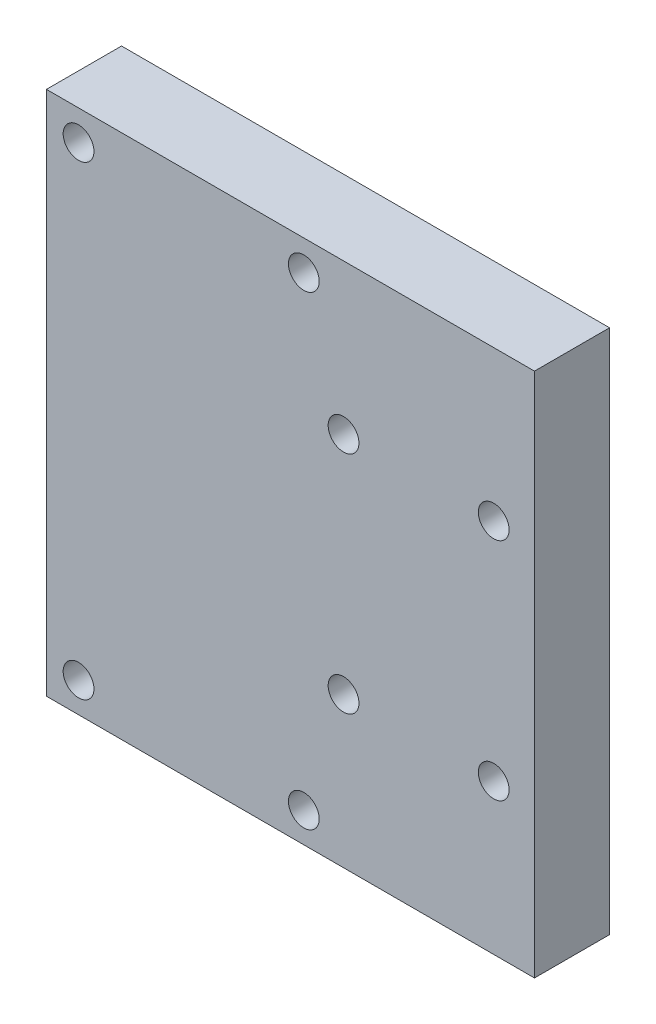
ISO-10303-21;
HEADER;
FILE_DESCRIPTION(('STEP AP214'),'2;1');
FILE_NAME('part.step','',(''),(''),'','','');
FILE_SCHEMA(('AUTOMOTIVE_DESIGN { 1 0 10303 214 1 1 1 1 }'));
ENDSEC;
DATA;
#1=APPLICATION_CONTEXT('core data for automotive mechanical design processes');
#2=APPLICATION_PROTOCOL_DEFINITION('international standard','automotive_design',2000,#1);
#3=PRODUCT_CONTEXT('',#1,'mechanical');
#4=PRODUCT('Part','Part','',(#3));
#5=PRODUCT_RELATED_PRODUCT_CATEGORY('part','',(#4));
#6=PRODUCT_DEFINITION_FORMATION('','',#4);
#7=PRODUCT_DEFINITION_CONTEXT('part definition',#1,'design');
#8=PRODUCT_DEFINITION('design','',#6,#7);
#9=PRODUCT_DEFINITION_SHAPE('','',#8);
#10=(LENGTH_UNIT() NAMED_UNIT(*) SI_UNIT(.MILLI.,.METRE.));
#11=(NAMED_UNIT(*) PLANE_ANGLE_UNIT() SI_UNIT($,.RADIAN.));
#12=(NAMED_UNIT(*) SI_UNIT($,.STERADIAN.) SOLID_ANGLE_UNIT());
#13=UNCERTAINTY_MEASURE_WITH_UNIT(LENGTH_MEASURE(1.E-05),#10,'distance_accuracy_value','');
#14=(GEOMETRIC_REPRESENTATION_CONTEXT(3) GLOBAL_UNCERTAINTY_ASSIGNED_CONTEXT((#13)) GLOBAL_UNIT_ASSIGNED_CONTEXT((#10,
#11,#12)) REPRESENTATION_CONTEXT('',''));
#15=CARTESIAN_POINT('',(0.,0.,0.));
#16=DIRECTION('',(0.,0.,1.));
#17=DIRECTION('',(1.,0.,0.));
#18=AXIS2_PLACEMENT_3D('',#15,#16,#17);
#19=CARTESIAN_POINT('',(0.,0.,10.));
#20=DIRECTION('',(0.,0.,1.));
#21=DIRECTION('',(1.,0.,0.));
#22=AXIS2_PLACEMENT_3D('',#19,#20,#21);
#23=PLANE('',#22);
#24=CARTESIAN_POINT('',(7.07003452523898,-15.,10.));
#25=DIRECTION('',(0.,0.,1.));
#26=DIRECTION('',(1.,0.,0.));
#27=AXIS2_PLACEMENT_3D('',#24,#25,#26);
#28=CIRCLE('',#27,2.05);
#29=CARTESIAN_POINT('',(9.12003452523898,-15.,10.));
#30=VERTEX_POINT('',#29);
#31=EDGE_CURVE('E148',#30,#30,#28,.T.);
#32=ORIENTED_EDGE('',*,*,#31,.F.);
#33=EDGE_LOOP('',(#32));
#34=FACE_BOUND('',#33,.T.);
#35=CARTESIAN_POINT('',(7.07003452523898,15.,10.));
#36=DIRECTION('',(0.,0.,1.));
#37=DIRECTION('',(1.,0.,0.));
#38=AXIS2_PLACEMENT_3D('',#35,#36,#37);
#39=CIRCLE('',#38,2.05);
#40=CARTESIAN_POINT('',(9.12003452523898,15.,10.));
#41=VERTEX_POINT('',#40);
#42=EDGE_CURVE('E136',#41,#41,#39,.T.);
#43=ORIENTED_EDGE('',*,*,#42,.F.);
#44=EDGE_LOOP('',(#43));
#45=FACE_BOUND('',#44,.T.);
#46=CARTESIAN_POINT('',(1.77843916611503,-31.,10.));
#47=DIRECTION('',(0.,0.,1.));
#48=DIRECTION('',(1.,0.,0.));
#49=AXIS2_PLACEMENT_3D('',#46,#47,#48);
#50=CIRCLE('',#49,2.05);
#51=CARTESIAN_POINT('',(3.82843916611503,-31.,10.));
#52=VERTEX_POINT('',#51);
#53=EDGE_CURVE('E124',#52,#52,#50,.T.);
#54=ORIENTED_EDGE('',*,*,#53,.F.);
#55=EDGE_LOOP('',(#54));
#56=FACE_BOUND('',#55,.T.);
#57=CARTESIAN_POINT('',(1.77843916611503,31.,10.));
#58=DIRECTION('',(0.,0.,1.));
#59=DIRECTION('',(1.,0.,0.));
#60=AXIS2_PLACEMENT_3D('',#57,#58,#59);
#61=CIRCLE('',#60,2.05);
#62=CARTESIAN_POINT('',(3.82843916611503,31.,10.));
#63=VERTEX_POINT('',#62);
#64=EDGE_CURVE('E103',#63,#63,#61,.T.);
#65=ORIENTED_EDGE('',*,*,#64,.F.);
#66=EDGE_LOOP('',(#65));
#67=FACE_BOUND('',#66,.T.);
#68=DIRECTION('',(0.,-1.,0.));
#69=VECTOR('',#68,1.);
#70=CARTESIAN_POINT('',(-32.5,35.,10.));
#71=LINE('',#70,#69);
#72=CARTESIAN_POINT('',(-32.5,35.,10.));
#73=VERTEX_POINT('',#72);
#74=CARTESIAN_POINT('',(-32.5,-35.,10.));
#75=VERTEX_POINT('',#74);
#76=EDGE_CURVE('E88',#73,#75,#71,.T.);
#77=ORIENTED_EDGE('',*,*,#76,.T.);
#78=DIRECTION('',(1.,0.,0.));
#79=VECTOR('',#78,1.);
#80=CARTESIAN_POINT('',(-32.5,-35.,10.));
#81=LINE('',#80,#79);
#82=CARTESIAN_POINT('',(32.5,-35.,10.));
#83=VERTEX_POINT('',#82);
#84=EDGE_CURVE('E83',#75,#83,#81,.T.);
#85=ORIENTED_EDGE('',*,*,#84,.T.);
#86=DIRECTION('',(0.,1.,0.));
#87=VECTOR('',#86,1.);
#88=CARTESIAN_POINT('',(32.5,35.,10.));
#89=LINE('',#88,#87);
#90=CARTESIAN_POINT('',(32.5,35.,10.));
#91=VERTEX_POINT('',#90);
#92=EDGE_CURVE('E86',#83,#91,#89,.T.);
#93=ORIENTED_EDGE('',*,*,#92,.T.);
#94=DIRECTION('',(-1.,0.,0.));
#95=VECTOR('',#94,1.);
#96=CARTESIAN_POINT('',(-32.5,35.,10.));
#97=LINE('',#96,#95);
#98=EDGE_CURVE('E53',#91,#73,#97,.T.);
#99=ORIENTED_EDGE('',*,*,#98,.T.);
#100=EDGE_LOOP('',(#77,#85,#93,#99));
#101=FACE_BOUND('',#100,.T.);
#102=CARTESIAN_POINT('',(-28.221560833885,31.,10.));
#103=DIRECTION('',(0.,0.,1.));
#104=DIRECTION('',(1.,0.,0.));
#105=AXIS2_PLACEMENT_3D('',#102,#103,#104);
#106=CIRCLE('',#105,2.05);
#107=CARTESIAN_POINT('',(-26.171560833885,31.,10.));
#108=VERTEX_POINT('',#107);
#109=EDGE_CURVE('E118',#108,#108,#106,.T.);
#110=ORIENTED_EDGE('',*,*,#109,.F.);
#111=EDGE_LOOP('',(#110));
#112=FACE_BOUND('',#111,.T.);
#113=CARTESIAN_POINT('',(-28.221560833885,-31.,10.));
#114=DIRECTION('',(0.,0.,1.));
#115=DIRECTION('',(1.,0.,0.));
#116=AXIS2_PLACEMENT_3D('',#113,#114,#115);
#117=CIRCLE('',#116,2.05);
#118=CARTESIAN_POINT('',(-26.171560833885,-31.,10.));
#119=VERTEX_POINT('',#118);
#120=EDGE_CURVE('E130',#119,#119,#117,.T.);
#121=ORIENTED_EDGE('',*,*,#120,.F.);
#122=EDGE_LOOP('',(#121));
#123=FACE_BOUND('',#122,.T.);
#124=CARTESIAN_POINT('',(27.070034525239,15.,10.));
#125=DIRECTION('',(0.,0.,1.));
#126=DIRECTION('',(1.,0.,0.));
#127=AXIS2_PLACEMENT_3D('',#124,#125,#126);
#128=CIRCLE('',#127,2.05);
#129=CARTESIAN_POINT('',(29.120034525239,15.,10.));
#130=VERTEX_POINT('',#129);
#131=EDGE_CURVE('E142',#130,#130,#128,.T.);
#132=ORIENTED_EDGE('',*,*,#131,.F.);
#133=EDGE_LOOP('',(#132));
#134=FACE_BOUND('',#133,.T.);
#135=CARTESIAN_POINT('',(27.070034525239,-15.,10.));
#136=DIRECTION('',(0.,0.,1.));
#137=DIRECTION('',(1.,0.,0.));
#138=AXIS2_PLACEMENT_3D('',#135,#136,#137);
#139=CIRCLE('',#138,2.05);
#140=CARTESIAN_POINT('',(29.120034525239,-15.,10.));
#141=VERTEX_POINT('',#140);
#142=EDGE_CURVE('E154',#141,#141,#139,.T.);
#143=ORIENTED_EDGE('',*,*,#142,.F.);
#144=EDGE_LOOP('',(#143));
#145=FACE_BOUND('',#144,.T.);
#146=ADVANCED_FACE('F36',(#34,#45,#56,#67,#101,#112,#123,#134,#145),#23,.T.);
#147=CARTESIAN_POINT('',(0.,0.,0.));
#148=DIRECTION('',(0.,0.,1.));
#149=DIRECTION('',(1.,0.,0.));
#150=AXIS2_PLACEMENT_3D('',#147,#148,#149);
#151=PLANE('',#150);
#152=DIRECTION('',(0.,-1.,0.));
#153=VECTOR('',#152,1.);
#154=CARTESIAN_POINT('',(-32.5,35.,0.));
#155=LINE('',#154,#153);
#156=CARTESIAN_POINT('',(-32.5,35.,0.));
#157=VERTEX_POINT('',#156);
#158=CARTESIAN_POINT('',(-32.5,-35.,0.));
#159=VERTEX_POINT('',#158);
#160=EDGE_CURVE('E100',#157,#159,#155,.T.);
#161=ORIENTED_EDGE('',*,*,#160,.F.);
#162=DIRECTION('',(-1.,0.,0.));
#163=VECTOR('',#162,1.);
#164=CARTESIAN_POINT('',(-32.5,35.,0.));
#165=LINE('',#164,#163);
#166=CARTESIAN_POINT('',(32.5,35.,0.));
#167=VERTEX_POINT('',#166);
#168=EDGE_CURVE('E76',#167,#157,#165,.T.);
#169=ORIENTED_EDGE('',*,*,#168,.F.);
#170=DIRECTION('',(0.,1.,0.));
#171=VECTOR('',#170,1.);
#172=CARTESIAN_POINT('',(32.5,35.,0.));
#173=LINE('',#172,#171);
#174=CARTESIAN_POINT('',(32.5,-35.,0.));
#175=VERTEX_POINT('',#174);
#176=EDGE_CURVE('E70',#175,#167,#173,.T.);
#177=ORIENTED_EDGE('',*,*,#176,.F.);
#178=DIRECTION('',(1.,0.,0.));
#179=VECTOR('',#178,1.);
#180=CARTESIAN_POINT('',(-32.5,-35.,0.));
#181=LINE('',#180,#179);
#182=EDGE_CURVE('E92',#159,#175,#181,.T.);
#183=ORIENTED_EDGE('',*,*,#182,.F.);
#184=EDGE_LOOP('',(#161,#169,#177,#183));
#185=FACE_BOUND('',#184,.T.);
#186=CARTESIAN_POINT('',(1.77843916611503,31.,0.));
#187=DIRECTION('',(0.,0.,1.));
#188=DIRECTION('',(1.,0.,0.));
#189=AXIS2_PLACEMENT_3D('',#186,#187,#188);
#190=CIRCLE('',#189,2.05);
#191=CARTESIAN_POINT('',(3.82843916611503,31.,0.));
#192=VERTEX_POINT('',#191);
#193=EDGE_CURVE('E115',#192,#192,#190,.T.);
#194=ORIENTED_EDGE('',*,*,#193,.T.);
#195=EDGE_LOOP('',(#194));
#196=FACE_BOUND('',#195,.T.);
#197=CARTESIAN_POINT('',(-28.221560833885,31.,0.));
#198=DIRECTION('',(0.,0.,1.));
#199=DIRECTION('',(1.,0.,0.));
#200=AXIS2_PLACEMENT_3D('',#197,#198,#199);
#201=CIRCLE('',#200,2.05);
#202=CARTESIAN_POINT('',(-26.171560833885,31.,0.));
#203=VERTEX_POINT('',#202);
#204=EDGE_CURVE('E121',#203,#203,#201,.T.);
#205=ORIENTED_EDGE('',*,*,#204,.T.);
#206=EDGE_LOOP('',(#205));
#207=FACE_BOUND('',#206,.T.);
#208=CARTESIAN_POINT('',(1.77843916611503,-31.,0.));
#209=DIRECTION('',(0.,0.,1.));
#210=DIRECTION('',(1.,0.,0.));
#211=AXIS2_PLACEMENT_3D('',#208,#209,#210);
#212=CIRCLE('',#211,2.05);
#213=CARTESIAN_POINT('',(3.82843916611503,-31.,0.));
#214=VERTEX_POINT('',#213);
#215=EDGE_CURVE('E127',#214,#214,#212,.T.);
#216=ORIENTED_EDGE('',*,*,#215,.T.);
#217=EDGE_LOOP('',(#216));
#218=FACE_BOUND('',#217,.T.);
#219=CARTESIAN_POINT('',(-28.221560833885,-31.,0.));
#220=DIRECTION('',(0.,0.,1.));
#221=DIRECTION('',(1.,0.,0.));
#222=AXIS2_PLACEMENT_3D('',#219,#220,#221);
#223=CIRCLE('',#222,2.05);
#224=CARTESIAN_POINT('',(-26.171560833885,-31.,0.));
#225=VERTEX_POINT('',#224);
#226=EDGE_CURVE('E133',#225,#225,#223,.T.);
#227=ORIENTED_EDGE('',*,*,#226,.T.);
#228=EDGE_LOOP('',(#227));
#229=FACE_BOUND('',#228,.T.);
#230=CARTESIAN_POINT('',(7.07003452523898,15.,0.));
#231=DIRECTION('',(0.,0.,1.));
#232=DIRECTION('',(1.,0.,0.));
#233=AXIS2_PLACEMENT_3D('',#230,#231,#232);
#234=CIRCLE('',#233,2.05);
#235=CARTESIAN_POINT('',(9.12003452523898,15.,0.));
#236=VERTEX_POINT('',#235);
#237=EDGE_CURVE('E139',#236,#236,#234,.T.);
#238=ORIENTED_EDGE('',*,*,#237,.T.);
#239=EDGE_LOOP('',(#238));
#240=FACE_BOUND('',#239,.T.);
#241=CARTESIAN_POINT('',(27.070034525239,15.,0.));
#242=DIRECTION('',(0.,0.,1.));
#243=DIRECTION('',(1.,0.,0.));
#244=AXIS2_PLACEMENT_3D('',#241,#242,#243);
#245=CIRCLE('',#244,2.05);
#246=CARTESIAN_POINT('',(29.120034525239,15.,0.));
#247=VERTEX_POINT('',#246);
#248=EDGE_CURVE('E145',#247,#247,#245,.T.);
#249=ORIENTED_EDGE('',*,*,#248,.T.);
#250=EDGE_LOOP('',(#249));
#251=FACE_BOUND('',#250,.T.);
#252=CARTESIAN_POINT('',(7.07003452523898,-15.,0.));
#253=DIRECTION('',(0.,0.,1.));
#254=DIRECTION('',(1.,0.,0.));
#255=AXIS2_PLACEMENT_3D('',#252,#253,#254);
#256=CIRCLE('',#255,2.05);
#257=CARTESIAN_POINT('',(9.12003452523898,-15.,0.));
#258=VERTEX_POINT('',#257);
#259=EDGE_CURVE('E151',#258,#258,#256,.T.);
#260=ORIENTED_EDGE('',*,*,#259,.T.);
#261=EDGE_LOOP('',(#260));
#262=FACE_BOUND('',#261,.T.);
#263=CARTESIAN_POINT('',(27.070034525239,-15.,0.));
#264=DIRECTION('',(0.,0.,1.));
#265=DIRECTION('',(1.,0.,0.));
#266=AXIS2_PLACEMENT_3D('',#263,#264,#265);
#267=CIRCLE('',#266,2.05);
#268=CARTESIAN_POINT('',(29.120034525239,-15.,0.));
#269=VERTEX_POINT('',#268);
#270=EDGE_CURVE('E157',#269,#269,#267,.T.);
#271=ORIENTED_EDGE('',*,*,#270,.T.);
#272=EDGE_LOOP('',(#271));
#273=FACE_BOUND('',#272,.T.);
#274=ADVANCED_FACE('F111',(#185,#196,#207,#218,#229,#240,#251,#262,#273),#151,.F.);
#275=CARTESIAN_POINT('',(-32.5,35.,10.));
#276=DIRECTION('',(1.,0.,0.));
#277=DIRECTION('',(0.,1.,0.));
#278=AXIS2_PLACEMENT_3D('',#275,#276,#277);
#279=PLANE('',#278);
#280=ORIENTED_EDGE('',*,*,#160,.T.);
#281=DIRECTION('',(0.,0.,-1.));
#282=VECTOR('',#281,1.);
#283=CARTESIAN_POINT('',(-32.5,-35.,10.));
#284=LINE('',#283,#282);
#285=EDGE_CURVE('E11',#75,#159,#284,.T.);
#286=ORIENTED_EDGE('',*,*,#285,.F.);
#287=ORIENTED_EDGE('',*,*,#76,.F.);
#288=DIRECTION('',(0.,0.,-1.));
#289=VECTOR('',#288,1.);
#290=CARTESIAN_POINT('',(-32.5,35.,10.));
#291=LINE('',#290,#289);
#292=EDGE_CURVE('E96',#73,#157,#291,.T.);
#293=ORIENTED_EDGE('',*,*,#292,.T.);
#294=EDGE_LOOP('',(#280,#286,#287,#293));
#295=FACE_BOUND('',#294,.T.);
#296=ADVANCED_FACE('F38',(#295),#279,.F.);
#297=CARTESIAN_POINT('',(-32.5,-35.,10.));
#298=DIRECTION('',(0.,1.,0.));
#299=DIRECTION('',(0.,0.,1.));
#300=AXIS2_PLACEMENT_3D('',#297,#298,#299);
#301=PLANE('',#300);
#302=ORIENTED_EDGE('',*,*,#182,.T.);
#303=DIRECTION('',(0.,0.,-1.));
#304=VECTOR('',#303,1.);
#305=CARTESIAN_POINT('',(32.5,-35.,10.));
#306=LINE('',#305,#304);
#307=EDGE_CURVE('E45',#83,#175,#306,.T.);
#308=ORIENTED_EDGE('',*,*,#307,.F.);
#309=ORIENTED_EDGE('',*,*,#84,.F.);
#310=ORIENTED_EDGE('',*,*,#285,.T.);
#311=EDGE_LOOP('',(#302,#308,#309,#310));
#312=FACE_BOUND('',#311,.T.);
#313=ADVANCED_FACE('F91',(#312),#301,.F.);
#314=CARTESIAN_POINT('',(32.5,35.,10.));
#315=DIRECTION('',(-1.,0.,0.));
#316=DIRECTION('',(0.,-1.,0.));
#317=AXIS2_PLACEMENT_3D('',#314,#315,#316);
#318=PLANE('',#317);
#319=ORIENTED_EDGE('',*,*,#176,.T.);
#320=DIRECTION('',(0.,0.,-1.));
#321=VECTOR('',#320,1.);
#322=CARTESIAN_POINT('',(32.5,35.,10.));
#323=LINE('',#322,#321);
#324=EDGE_CURVE('E93',#91,#167,#323,.T.);
#325=ORIENTED_EDGE('',*,*,#324,.F.);
#326=ORIENTED_EDGE('',*,*,#92,.F.);
#327=ORIENTED_EDGE('',*,*,#307,.T.);
#328=EDGE_LOOP('',(#319,#325,#326,#327));
#329=FACE_BOUND('',#328,.T.);
#330=ADVANCED_FACE('F94',(#329),#318,.F.);
#331=CARTESIAN_POINT('',(-32.5,35.,10.));
#332=DIRECTION('',(0.,-1.,0.));
#333=DIRECTION('',(0.,0.,-1.));
#334=AXIS2_PLACEMENT_3D('',#331,#332,#333);
#335=PLANE('',#334);
#336=ORIENTED_EDGE('',*,*,#168,.T.);
#337=ORIENTED_EDGE('',*,*,#292,.F.);
#338=ORIENTED_EDGE('',*,*,#98,.F.);
#339=ORIENTED_EDGE('',*,*,#324,.T.);
#340=EDGE_LOOP('',(#336,#337,#338,#339));
#341=FACE_BOUND('',#340,.T.);
#342=ADVANCED_FACE('F108',(#341),#335,.F.);
#343=CARTESIAN_POINT('',(1.77843916611503,31.,10.));
#344=DIRECTION('',(0.,0.,-1.));
#345=DIRECTION('',(-1.,0.,0.));
#346=AXIS2_PLACEMENT_3D('',#343,#344,#345);
#347=CYLINDRICAL_SURFACE('',#346,2.05);
#348=ORIENTED_EDGE('',*,*,#64,.T.);
#349=EDGE_LOOP('',(#348));
#350=FACE_BOUND('',#349,.T.);
#351=ORIENTED_EDGE('',*,*,#193,.F.);
#352=EDGE_LOOP('',(#351));
#353=FACE_BOUND('',#352,.T.);
#354=ADVANCED_FACE('F176',(#350,#353),#347,.F.);
#355=CARTESIAN_POINT('',(-28.221560833885,31.,10.));
#356=DIRECTION('',(0.,0.,-1.));
#357=DIRECTION('',(-1.,0.,0.));
#358=AXIS2_PLACEMENT_3D('',#355,#356,#357);
#359=CYLINDRICAL_SURFACE('',#358,2.05);
#360=ORIENTED_EDGE('',*,*,#109,.T.);
#361=EDGE_LOOP('',(#360));
#362=FACE_BOUND('',#361,.T.);
#363=ORIENTED_EDGE('',*,*,#204,.F.);
#364=EDGE_LOOP('',(#363));
#365=FACE_BOUND('',#364,.T.);
#366=ADVANCED_FACE('F222',(#362,#365),#359,.F.);
#367=CARTESIAN_POINT('',(1.77843916611503,-31.,10.));
#368=DIRECTION('',(0.,0.,-1.));
#369=DIRECTION('',(-1.,0.,0.));
#370=AXIS2_PLACEMENT_3D('',#367,#368,#369);
#371=CYLINDRICAL_SURFACE('',#370,2.05);
#372=ORIENTED_EDGE('',*,*,#53,.T.);
#373=EDGE_LOOP('',(#372));
#374=FACE_BOUND('',#373,.T.);
#375=ORIENTED_EDGE('',*,*,#215,.F.);
#376=EDGE_LOOP('',(#375));
#377=FACE_BOUND('',#376,.T.);
#378=ADVANCED_FACE('F230',(#374,#377),#371,.F.);
#379=CARTESIAN_POINT('',(-28.221560833885,-31.,10.));
#380=DIRECTION('',(0.,0.,-1.));
#381=DIRECTION('',(-1.,0.,0.));
#382=AXIS2_PLACEMENT_3D('',#379,#380,#381);
#383=CYLINDRICAL_SURFACE('',#382,2.05);
#384=ORIENTED_EDGE('',*,*,#120,.T.);
#385=EDGE_LOOP('',(#384));
#386=FACE_BOUND('',#385,.T.);
#387=ORIENTED_EDGE('',*,*,#226,.F.);
#388=EDGE_LOOP('',(#387));
#389=FACE_BOUND('',#388,.T.);
#390=ADVANCED_FACE('F238',(#386,#389),#383,.F.);
#391=CARTESIAN_POINT('',(7.07003452523898,15.,10.));
#392=DIRECTION('',(0.,0.,-1.));
#393=DIRECTION('',(-1.,0.,0.));
#394=AXIS2_PLACEMENT_3D('',#391,#392,#393);
#395=CYLINDRICAL_SURFACE('',#394,2.05);
#396=ORIENTED_EDGE('',*,*,#42,.T.);
#397=EDGE_LOOP('',(#396));
#398=FACE_BOUND('',#397,.T.);
#399=ORIENTED_EDGE('',*,*,#237,.F.);
#400=EDGE_LOOP('',(#399));
#401=FACE_BOUND('',#400,.T.);
#402=ADVANCED_FACE('F247',(#398,#401),#395,.F.);
#403=CARTESIAN_POINT('',(27.070034525239,15.,10.));
#404=DIRECTION('',(0.,0.,-1.));
#405=DIRECTION('',(-1.,0.,0.));
#406=AXIS2_PLACEMENT_3D('',#403,#404,#405);
#407=CYLINDRICAL_SURFACE('',#406,2.05);
#408=ORIENTED_EDGE('',*,*,#131,.T.);
#409=EDGE_LOOP('',(#408));
#410=FACE_BOUND('',#409,.T.);
#411=ORIENTED_EDGE('',*,*,#248,.F.);
#412=EDGE_LOOP('',(#411));
#413=FACE_BOUND('',#412,.T.);
#414=ADVANCED_FACE('F256',(#410,#413),#407,.F.);
#415=CARTESIAN_POINT('',(7.07003452523898,-15.,10.));
#416=DIRECTION('',(0.,0.,-1.));
#417=DIRECTION('',(-1.,0.,0.));
#418=AXIS2_PLACEMENT_3D('',#415,#416,#417);
#419=CYLINDRICAL_SURFACE('',#418,2.05);
#420=ORIENTED_EDGE('',*,*,#31,.T.);
#421=EDGE_LOOP('',(#420));
#422=FACE_BOUND('',#421,.T.);
#423=ORIENTED_EDGE('',*,*,#259,.F.);
#424=EDGE_LOOP('',(#423));
#425=FACE_BOUND('',#424,.T.);
#426=ADVANCED_FACE('F265',(#422,#425),#419,.F.);
#427=CARTESIAN_POINT('',(27.070034525239,-15.,10.));
#428=DIRECTION('',(0.,0.,-1.));
#429=DIRECTION('',(-1.,0.,0.));
#430=AXIS2_PLACEMENT_3D('',#427,#428,#429);
#431=CYLINDRICAL_SURFACE('',#430,2.05);
#432=ORIENTED_EDGE('',*,*,#142,.T.);
#433=EDGE_LOOP('',(#432));
#434=FACE_BOUND('',#433,.T.);
#435=ORIENTED_EDGE('',*,*,#270,.F.);
#436=EDGE_LOOP('',(#435));
#437=FACE_BOUND('',#436,.T.);
#438=ADVANCED_FACE('F163',(#434,#437),#431,.F.);
#439=CLOSED_SHELL('',(#146,#274,#296,#313,#330,#342,#354,#366,#378,#390,#402,#414,#426,#438));
#440=MANIFOLD_SOLID_BREP('B2',#439);
#441=ADVANCED_BREP_SHAPE_REPRESENTATION('',(#18,#440),#14);
#442=SHAPE_DEFINITION_REPRESENTATION(#9,#441);
ENDSEC;
END-ISO-10303-21;
